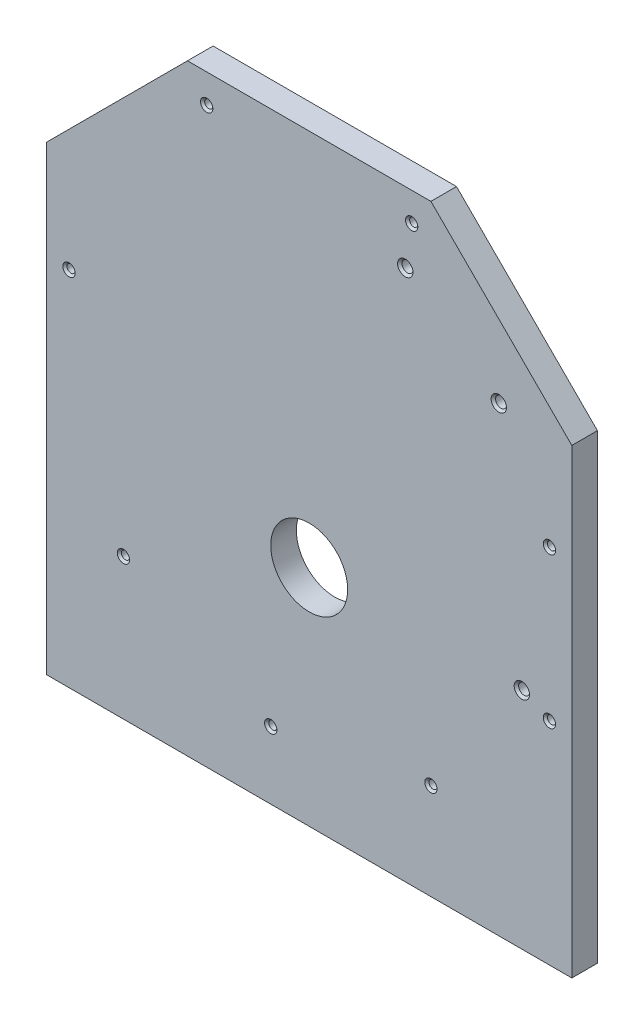
ISO-10303-21;
HEADER;
FILE_DESCRIPTION(('STEP AP214'),'2;1');
FILE_NAME('part.step','',(''),(''),'','','');
FILE_SCHEMA(('AUTOMOTIVE_DESIGN { 1 0 10303 214 1 1 1 1 }'));
ENDSEC;
DATA;
#1=APPLICATION_CONTEXT('core data for automotive mechanical design processes');
#2=APPLICATION_PROTOCOL_DEFINITION('international standard','automotive_design',2000,#1);
#3=PRODUCT_CONTEXT('',#1,'mechanical');
#4=PRODUCT('Part','Part','',(#3));
#5=PRODUCT_RELATED_PRODUCT_CATEGORY('part','',(#4));
#6=PRODUCT_DEFINITION_FORMATION('','',#4);
#7=PRODUCT_DEFINITION_CONTEXT('part definition',#1,'design');
#8=PRODUCT_DEFINITION('design','',#6,#7);
#9=PRODUCT_DEFINITION_SHAPE('','',#8);
#10=(LENGTH_UNIT() NAMED_UNIT(*) SI_UNIT(.MILLI.,.METRE.));
#11=(NAMED_UNIT(*) PLANE_ANGLE_UNIT() SI_UNIT($,.RADIAN.));
#12=(NAMED_UNIT(*) SI_UNIT($,.STERADIAN.) SOLID_ANGLE_UNIT());
#13=UNCERTAINTY_MEASURE_WITH_UNIT(LENGTH_MEASURE(1.E-05),#10,'distance_accuracy_value','');
#14=(GEOMETRIC_REPRESENTATION_CONTEXT(3) GLOBAL_UNCERTAINTY_ASSIGNED_CONTEXT((#13)) GLOBAL_UNIT_ASSIGNED_CONTEXT((#10,
#11,#12)) REPRESENTATION_CONTEXT('',''));
#15=CARTESIAN_POINT('',(0.,0.,0.));
#16=DIRECTION('',(0.,0.,1.));
#17=DIRECTION('',(1.,0.,0.));
#18=AXIS2_PLACEMENT_3D('',#15,#16,#17);
#19=CARTESIAN_POINT('',(0.,0.,0.));
#20=DIRECTION('',(0.,0.,1.));
#21=DIRECTION('',(1.,0.,0.));
#22=AXIS2_PLACEMENT_3D('',#19,#20,#21);
#23=PLANE('',#22);
#24=CARTESIAN_POINT('',(105.41,-57.15,0.));
#25=DIRECTION('',(0.,0.,-1.));
#26=DIRECTION('',(-1.,0.,0.));
#27=AXIS2_PLACEMENT_3D('',#24,#25,#26);
#28=CIRCLE('',#27,3.80999999999999);
#29=CARTESIAN_POINT('',(101.6,-57.15,0.));
#30=VERTEX_POINT('',#29);
#31=EDGE_CURVE('E321',#30,#30,#28,.T.);
#32=ORIENTED_EDGE('',*,*,#31,.F.);
#33=EDGE_LOOP('',(#32));
#34=FACE_BOUND('',#33,.T.);
#35=CARTESIAN_POINT('',(93.98,60.325,0.));
#36=DIRECTION('',(0.,0.,-1.));
#37=DIRECTION('',(-1.,0.,0.));
#38=AXIS2_PLACEMENT_3D('',#35,#36,#37);
#39=CIRCLE('',#38,3.80999999999999);
#40=CARTESIAN_POINT('',(90.17,60.325,0.));
#41=VERTEX_POINT('',#40);
#42=EDGE_CURVE('E337',#41,#41,#39,.T.);
#43=ORIENTED_EDGE('',*,*,#42,.F.);
#44=EDGE_LOOP('',(#43));
#45=FACE_BOUND('',#44,.T.);
#46=CARTESIAN_POINT('',(47.625,95.25,0.));
#47=DIRECTION('',(0.,0.,-1.));
#48=DIRECTION('',(-1.,0.,0.));
#49=AXIS2_PLACEMENT_3D('',#46,#47,#48);
#50=CIRCLE('',#49,3.81);
#51=CARTESIAN_POINT('',(43.815,95.25,0.));
#52=VERTEX_POINT('',#51);
#53=EDGE_CURVE('E348',#52,#52,#50,.T.);
#54=ORIENTED_EDGE('',*,*,#53,.F.);
#55=EDGE_LOOP('',(#54));
#56=FACE_BOUND('',#55,.T.);
#57=CARTESIAN_POINT('',(-50.8,115.8875,0.));
#58=DIRECTION('',(0.,0.,-1.));
#59=DIRECTION('',(-1.,0.,0.));
#60=AXIS2_PLACEMENT_3D('',#57,#58,#59);
#61=CIRCLE('',#60,3.048);
#62=CARTESIAN_POINT('',(-53.848,115.8875,0.));
#63=VERTEX_POINT('',#62);
#64=EDGE_CURVE('E515',#63,#63,#61,.T.);
#65=ORIENTED_EDGE('',*,*,#64,.F.);
#66=EDGE_LOOP('',(#65));
#67=FACE_BOUND('',#66,.T.);
#68=CARTESIAN_POINT('',(-92.075,-98.425,0.));
#69=DIRECTION('',(0.,0.,-1.));
#70=DIRECTION('',(-1.,0.,0.));
#71=AXIS2_PLACEMENT_3D('',#68,#69,#70);
#72=CIRCLE('',#71,3.048);
#73=CARTESIAN_POINT('',(-95.123,-98.425,0.));
#74=VERTEX_POINT('',#73);
#75=EDGE_CURVE('E447',#74,#74,#72,.T.);
#76=ORIENTED_EDGE('',*,*,#75,.F.);
#77=EDGE_LOOP('',(#76));
#78=FACE_BOUND('',#77,.T.);
#79=CARTESIAN_POINT('',(60.325,-120.65,0.));
#80=DIRECTION('',(0.,0.,-1.));
#81=DIRECTION('',(-1.,0.,0.));
#82=AXIS2_PLACEMENT_3D('',#79,#80,#81);
#83=CIRCLE('',#82,3.048);
#84=CARTESIAN_POINT('',(57.277,-120.65,0.));
#85=VERTEX_POINT('',#84);
#86=EDGE_CURVE('E378',#85,#85,#83,.T.);
#87=ORIENTED_EDGE('',*,*,#86,.F.);
#88=EDGE_LOOP('',(#87));
#89=FACE_BOUND('',#88,.T.);
#90=CARTESIAN_POINT('',(119.0752,-63.5,0.));
#91=DIRECTION('',(0.,0.,-1.));
#92=DIRECTION('',(-1.,0.,0.));
#93=AXIS2_PLACEMENT_3D('',#90,#91,#92);
#94=CIRCLE('',#93,3.048);
#95=CARTESIAN_POINT('',(116.0272,-63.5,0.));
#96=VERTEX_POINT('',#95);
#97=EDGE_CURVE('E407',#96,#96,#94,.T.);
#98=ORIENTED_EDGE('',*,*,#97,.F.);
#99=EDGE_LOOP('',(#98));
#100=FACE_BOUND('',#99,.T.);
#101=DIRECTION('',(0.,1.,0.));
#102=VECTOR('',#101,1.);
#103=CARTESIAN_POINT('',(130.175,-168.275,0.));
#104=LINE('',#103,#102);
#105=CARTESIAN_POINT('',(130.175,-168.275,0.));
#106=VERTEX_POINT('',#105);
#107=CARTESIAN_POINT('',(130.175,60.3249999999998,0.));
#108=VERTEX_POINT('',#107);
#109=EDGE_CURVE('E137',#106,#108,#104,.T.);
#110=ORIENTED_EDGE('',*,*,#109,.F.);
#111=DIRECTION('',(1.,0.,0.));
#112=VECTOR('',#111,1.);
#113=CARTESIAN_POINT('',(-130.175,-168.275,0.));
#114=LINE('',#113,#112);
#115=CARTESIAN_POINT('',(-130.175,-168.275,0.));
#116=VERTEX_POINT('',#115);
#117=EDGE_CURVE('E97',#116,#106,#114,.T.);
#118=ORIENTED_EDGE('',*,*,#117,.F.);
#119=DIRECTION('',(0.,-1.,0.));
#120=VECTOR('',#119,1.);
#121=CARTESIAN_POINT('',(-130.175,60.3250000000002,0.));
#122=LINE('',#121,#120);
#123=CARTESIAN_POINT('',(-130.175,60.3250000000002,0.));
#124=VERTEX_POINT('',#123);
#125=EDGE_CURVE('E91',#124,#116,#122,.T.);
#126=ORIENTED_EDGE('',*,*,#125,.F.);
#127=DIRECTION('',(-0.707106781186549,-0.707106781186547,0.));
#128=VECTOR('',#127,1.);
#129=CARTESIAN_POINT('',(-60.325,130.175,0.));
#130=LINE('',#129,#128);
#131=CARTESIAN_POINT('',(-60.325,130.175,0.));
#132=VERTEX_POINT('',#131);
#133=EDGE_CURVE('E127',#132,#124,#130,.T.);
#134=ORIENTED_EDGE('',*,*,#133,.F.);
#135=DIRECTION('',(-1.,0.,0.));
#136=VECTOR('',#135,1.);
#137=CARTESIAN_POINT('',(60.325,130.175,0.));
#138=LINE('',#137,#136);
#139=CARTESIAN_POINT('',(60.325,130.175,0.));
#140=VERTEX_POINT('',#139);
#141=EDGE_CURVE('E143',#140,#132,#138,.T.);
#142=ORIENTED_EDGE('',*,*,#141,.F.);
#143=DIRECTION('',(-0.707106781186546,0.707106781186549,0.));
#144=VECTOR('',#143,1.);
#145=CARTESIAN_POINT('',(130.175,60.3249999999998,0.));
#146=LINE('',#145,#144);
#147=EDGE_CURVE('E140',#108,#140,#146,.T.);
#148=ORIENTED_EDGE('',*,*,#147,.F.);
#149=EDGE_LOOP('',(#110,#118,#126,#134,#142,#148));
#150=FACE_BOUND('',#149,.T.);
#151=CARTESIAN_POINT('',(0.,-57.15,0.));
#152=DIRECTION('',(0.,0.,1.));
#153=DIRECTION('',(1.,0.,0.));
#154=AXIS2_PLACEMENT_3D('',#151,#152,#153);
#155=CIRCLE('',#154,19.0754);
#156=CARTESIAN_POINT('',(19.0754,-57.15,0.));
#157=VERTEX_POINT('',#156);
#158=EDGE_CURVE('E418',#157,#157,#155,.T.);
#159=ORIENTED_EDGE('',*,*,#158,.T.);
#160=EDGE_LOOP('',(#159));
#161=FACE_BOUND('',#160,.T.);
#162=CARTESIAN_POINT('',(119.0752,11.1252,0.));
#163=DIRECTION('',(0.,0.,-1.));
#164=DIRECTION('',(-1.,0.,0.));
#165=AXIS2_PLACEMENT_3D('',#162,#163,#164);
#166=CIRCLE('',#165,3.048);
#167=CARTESIAN_POINT('',(116.0272,11.1252,0.));
#168=VERTEX_POINT('',#167);
#169=EDGE_CURVE('E394',#168,#168,#166,.T.);
#170=ORIENTED_EDGE('',*,*,#169,.F.);
#171=EDGE_LOOP('',(#170));
#172=FACE_BOUND('',#171,.T.);
#173=CARTESIAN_POINT('',(-19.05,-134.9375,0.));
#174=DIRECTION('',(0.,0.,-1.));
#175=DIRECTION('',(-1.,0.,0.));
#176=AXIS2_PLACEMENT_3D('',#173,#174,#175);
#177=CIRCLE('',#176,3.048);
#178=CARTESIAN_POINT('',(-22.098,-134.9375,0.));
#179=VERTEX_POINT('',#178);
#180=EDGE_CURVE('E460',#179,#179,#177,.T.);
#181=ORIENTED_EDGE('',*,*,#180,.F.);
#182=EDGE_LOOP('',(#181));
#183=FACE_BOUND('',#182,.T.);
#184=CARTESIAN_POINT('',(-119.0752,11.1252,0.));
#185=DIRECTION('',(0.,0.,-1.));
#186=DIRECTION('',(-1.,0.,0.));
#187=AXIS2_PLACEMENT_3D('',#184,#185,#186);
#188=CIRCLE('',#187,3.048);
#189=CARTESIAN_POINT('',(-122.1232,11.1252,0.));
#190=VERTEX_POINT('',#189);
#191=EDGE_CURVE('E431',#190,#190,#188,.T.);
#192=ORIENTED_EDGE('',*,*,#191,.F.);
#193=EDGE_LOOP('',(#192));
#194=FACE_BOUND('',#193,.T.);
#195=CARTESIAN_POINT('',(50.8,115.8875,0.));
#196=DIRECTION('',(0.,0.,-1.));
#197=DIRECTION('',(-1.,0.,0.));
#198=AXIS2_PLACEMENT_3D('',#195,#196,#197);
#199=CIRCLE('',#198,3.048);
#200=CARTESIAN_POINT('',(47.752,115.8875,0.));
#201=VERTEX_POINT('',#200);
#202=EDGE_CURVE('E364',#201,#201,#199,.T.);
#203=ORIENTED_EDGE('',*,*,#202,.F.);
#204=EDGE_LOOP('',(#203));
#205=FACE_BOUND('',#204,.T.);
#206=ADVANCED_FACE('F48',(#34,#45,#56,#67,#78,#89,#100,#150,#161,#172,#183,#194,#205),#23,.F.);
#207=CARTESIAN_POINT('',(0.,0.,12.7));
#208=DIRECTION('',(0.,0.,1.));
#209=DIRECTION('',(1.,0.,0.));
#210=AXIS2_PLACEMENT_3D('',#207,#208,#209);
#211=PLANE('',#210);
#212=CARTESIAN_POINT('',(105.41,-57.15,12.7));
#213=DIRECTION('',(0.,0.,-1.));
#214=DIRECTION('',(-1.,0.,0.));
#215=AXIS2_PLACEMENT_3D('',#212,#213,#214);
#216=CIRCLE('',#215,3.80999999999999);
#217=CARTESIAN_POINT('',(101.6,-57.15,12.7));
#218=VERTEX_POINT('',#217);
#219=EDGE_CURVE('E323',#218,#218,#216,.T.);
#220=ORIENTED_EDGE('',*,*,#219,.T.);
#221=EDGE_LOOP('',(#220));
#222=FACE_BOUND('',#221,.T.);
#223=CARTESIAN_POINT('',(93.98,60.325,12.7));
#224=DIRECTION('',(0.,0.,-1.));
#225=DIRECTION('',(-1.,0.,0.));
#226=AXIS2_PLACEMENT_3D('',#223,#224,#225);
#227=CIRCLE('',#226,3.80999999999999);
#228=CARTESIAN_POINT('',(90.17,60.325,12.7));
#229=VERTEX_POINT('',#228);
#230=EDGE_CURVE('E334',#229,#229,#227,.T.);
#231=ORIENTED_EDGE('',*,*,#230,.T.);
#232=EDGE_LOOP('',(#231));
#233=FACE_BOUND('',#232,.T.);
#234=CARTESIAN_POINT('',(47.625,95.25,12.7));
#235=DIRECTION('',(0.,0.,-1.));
#236=DIRECTION('',(-1.,0.,0.));
#237=AXIS2_PLACEMENT_3D('',#234,#235,#236);
#238=CIRCLE('',#237,3.80999999999999);
#239=CARTESIAN_POINT('',(43.815,95.25,12.7));
#240=VERTEX_POINT('',#239);
#241=EDGE_CURVE('E355',#240,#240,#238,.T.);
#242=ORIENTED_EDGE('',*,*,#241,.T.);
#243=EDGE_LOOP('',(#242));
#244=FACE_BOUND('',#243,.T.);
#245=CARTESIAN_POINT('',(50.8,115.8875,12.7));
#246=DIRECTION('',(0.,0.,-1.));
#247=DIRECTION('',(-1.,0.,0.));
#248=AXIS2_PLACEMENT_3D('',#245,#246,#247);
#249=CIRCLE('',#248,3.048);
#250=CARTESIAN_POINT('',(47.752,115.8875,12.7));
#251=VERTEX_POINT('',#250);
#252=EDGE_CURVE('E361',#251,#251,#249,.T.);
#253=ORIENTED_EDGE('',*,*,#252,.T.);
#254=EDGE_LOOP('',(#253));
#255=FACE_BOUND('',#254,.T.);
#256=CARTESIAN_POINT('',(-50.8,115.8875,12.7));
#257=DIRECTION('',(0.,0.,-1.));
#258=DIRECTION('',(-1.,0.,0.));
#259=AXIS2_PLACEMENT_3D('',#256,#257,#258);
#260=CIRCLE('',#259,3.048);
#261=CARTESIAN_POINT('',(-53.848,115.8875,12.7));
#262=VERTEX_POINT('',#261);
#263=EDGE_CURVE('E533',#262,#262,#260,.T.);
#264=ORIENTED_EDGE('',*,*,#263,.T.);
#265=EDGE_LOOP('',(#264));
#266=FACE_BOUND('',#265,.T.);
#267=CARTESIAN_POINT('',(-119.0752,11.1252,12.7));
#268=DIRECTION('',(0.,0.,-1.));
#269=DIRECTION('',(-1.,0.,0.));
#270=AXIS2_PLACEMENT_3D('',#267,#268,#269);
#271=CIRCLE('',#270,3.048);
#272=CARTESIAN_POINT('',(-122.1232,11.1252,12.7));
#273=VERTEX_POINT('',#272);
#274=EDGE_CURVE('E438',#273,#273,#271,.T.);
#275=ORIENTED_EDGE('',*,*,#274,.T.);
#276=EDGE_LOOP('',(#275));
#277=FACE_BOUND('',#276,.T.);
#278=CARTESIAN_POINT('',(-92.075,-98.425,12.7));
#279=DIRECTION('',(0.,0.,-1.));
#280=DIRECTION('',(-1.,0.,0.));
#281=AXIS2_PLACEMENT_3D('',#278,#279,#280);
#282=CIRCLE('',#281,3.048);
#283=CARTESIAN_POINT('',(-95.123,-98.425,12.7));
#284=VERTEX_POINT('',#283);
#285=EDGE_CURVE('E445',#284,#284,#282,.T.);
#286=ORIENTED_EDGE('',*,*,#285,.T.);
#287=EDGE_LOOP('',(#286));
#288=FACE_BOUND('',#287,.T.);
#289=CARTESIAN_POINT('',(-19.05,-134.9375,12.7));
#290=DIRECTION('',(0.,0.,-1.));
#291=DIRECTION('',(-1.,0.,0.));
#292=AXIS2_PLACEMENT_3D('',#289,#290,#291);
#293=CIRCLE('',#292,3.048);
#294=CARTESIAN_POINT('',(-22.098,-134.9375,12.7));
#295=VERTEX_POINT('',#294);
#296=EDGE_CURVE('E458',#295,#295,#293,.T.);
#297=ORIENTED_EDGE('',*,*,#296,.T.);
#298=EDGE_LOOP('',(#297));
#299=FACE_BOUND('',#298,.T.);
#300=CARTESIAN_POINT('',(60.325,-120.65,12.7));
#301=DIRECTION('',(0.,0.,-1.));
#302=DIRECTION('',(-1.,0.,0.));
#303=AXIS2_PLACEMENT_3D('',#300,#301,#302);
#304=CIRCLE('',#303,3.048);
#305=CARTESIAN_POINT('',(57.277,-120.65,12.7));
#306=VERTEX_POINT('',#305);
#307=EDGE_CURVE('E385',#306,#306,#304,.T.);
#308=ORIENTED_EDGE('',*,*,#307,.T.);
#309=EDGE_LOOP('',(#308));
#310=FACE_BOUND('',#309,.T.);
#311=CARTESIAN_POINT('',(119.0752,11.1252,12.7));
#312=DIRECTION('',(0.,0.,-1.));
#313=DIRECTION('',(-1.,0.,0.));
#314=AXIS2_PLACEMENT_3D('',#311,#312,#313);
#315=CIRCLE('',#314,3.048);
#316=CARTESIAN_POINT('',(116.0272,11.1252,12.7));
#317=VERTEX_POINT('',#316);
#318=EDGE_CURVE('E392',#317,#317,#315,.T.);
#319=ORIENTED_EDGE('',*,*,#318,.T.);
#320=EDGE_LOOP('',(#319));
#321=FACE_BOUND('',#320,.T.);
#322=CARTESIAN_POINT('',(119.0752,-63.5,12.7));
#323=DIRECTION('',(0.,0.,-1.));
#324=DIRECTION('',(-1.,0.,0.));
#325=AXIS2_PLACEMENT_3D('',#322,#323,#324);
#326=CIRCLE('',#325,3.048);
#327=CARTESIAN_POINT('',(116.0272,-63.5,12.7));
#328=VERTEX_POINT('',#327);
#329=EDGE_CURVE('E405',#328,#328,#326,.T.);
#330=ORIENTED_EDGE('',*,*,#329,.T.);
#331=EDGE_LOOP('',(#330));
#332=FACE_BOUND('',#331,.T.);
#333=DIRECTION('',(0.,1.,0.));
#334=VECTOR('',#333,1.);
#335=CARTESIAN_POINT('',(130.175,-168.275,12.7));
#336=LINE('',#335,#334);
#337=CARTESIAN_POINT('',(130.175,-168.275,12.7));
#338=VERTEX_POINT('',#337);
#339=CARTESIAN_POINT('',(130.175,60.3249999999998,12.7));
#340=VERTEX_POINT('',#339);
#341=EDGE_CURVE('E148',#338,#340,#336,.T.);
#342=ORIENTED_EDGE('',*,*,#341,.T.);
#343=DIRECTION('',(-0.707106781186546,0.707106781186549,0.));
#344=VECTOR('',#343,1.);
#345=CARTESIAN_POINT('',(130.175,60.3249999999998,12.7));
#346=LINE('',#345,#344);
#347=CARTESIAN_POINT('',(60.325,130.175,12.7));
#348=VERTEX_POINT('',#347);
#349=EDGE_CURVE('E105',#340,#348,#346,.T.);
#350=ORIENTED_EDGE('',*,*,#349,.T.);
#351=DIRECTION('',(-1.,0.,0.));
#352=VECTOR('',#351,1.);
#353=CARTESIAN_POINT('',(60.325,130.175,12.7));
#354=LINE('',#353,#352);
#355=CARTESIAN_POINT('',(-60.325,130.175,12.7));
#356=VERTEX_POINT('',#355);
#357=EDGE_CURVE('E119',#348,#356,#354,.T.);
#358=ORIENTED_EDGE('',*,*,#357,.T.);
#359=DIRECTION('',(-0.707106781186549,-0.707106781186547,0.));
#360=VECTOR('',#359,1.);
#361=CARTESIAN_POINT('',(-60.325,130.175,12.7));
#362=LINE('',#361,#360);
#363=CARTESIAN_POINT('',(-130.175,60.3250000000002,12.7));
#364=VERTEX_POINT('',#363);
#365=EDGE_CURVE('E112',#356,#364,#362,.T.);
#366=ORIENTED_EDGE('',*,*,#365,.T.);
#367=DIRECTION('',(0.,-1.,0.));
#368=VECTOR('',#367,1.);
#369=CARTESIAN_POINT('',(-130.175,60.3250000000002,12.7));
#370=LINE('',#369,#368);
#371=CARTESIAN_POINT('',(-130.175,-168.275,12.7));
#372=VERTEX_POINT('',#371);
#373=EDGE_CURVE('E117',#364,#372,#370,.T.);
#374=ORIENTED_EDGE('',*,*,#373,.T.);
#375=DIRECTION('',(1.,0.,0.));
#376=VECTOR('',#375,1.);
#377=CARTESIAN_POINT('',(-130.175,-168.275,12.7));
#378=LINE('',#377,#376);
#379=EDGE_CURVE('E65',#372,#338,#378,.T.);
#380=ORIENTED_EDGE('',*,*,#379,.T.);
#381=EDGE_LOOP('',(#342,#350,#358,#366,#374,#380));
#382=FACE_BOUND('',#381,.T.);
#383=CARTESIAN_POINT('',(0.,-57.15,12.7));
#384=DIRECTION('',(0.,0.,1.));
#385=DIRECTION('',(1.,0.,0.));
#386=AXIS2_PLACEMENT_3D('',#383,#384,#385);
#387=CIRCLE('',#386,19.0754);
#388=CARTESIAN_POINT('',(19.0754,-57.15,12.7));
#389=VERTEX_POINT('',#388);
#390=EDGE_CURVE('E141',#389,#389,#387,.T.);
#391=ORIENTED_EDGE('',*,*,#390,.F.);
#392=EDGE_LOOP('',(#391));
#393=FACE_BOUND('',#392,.T.);
#394=ADVANCED_FACE('F114',(#222,#233,#244,#255,#266,#277,#288,#299,#310,#321,#332,#382,#393),
#211,.T.);
#395=CARTESIAN_POINT('',(130.175,-168.275,12.7));
#396=DIRECTION('',(-1.,0.,0.));
#397=DIRECTION('',(0.,-1.,0.));
#398=AXIS2_PLACEMENT_3D('',#395,#396,#397);
#399=PLANE('',#398);
#400=ORIENTED_EDGE('',*,*,#109,.T.);
#401=DIRECTION('',(0.,0.,-1.));
#402=VECTOR('',#401,1.);
#403=CARTESIAN_POINT('',(130.175,60.3249999999998,12.7));
#404=LINE('',#403,#402);
#405=EDGE_CURVE('E12',#340,#108,#404,.T.);
#406=ORIENTED_EDGE('',*,*,#405,.F.);
#407=ORIENTED_EDGE('',*,*,#341,.F.);
#408=DIRECTION('',(0.,0.,-1.));
#409=VECTOR('',#408,1.);
#410=CARTESIAN_POINT('',(130.175,-168.275,12.7));
#411=LINE('',#410,#409);
#412=EDGE_CURVE('E133',#338,#106,#411,.T.);
#413=ORIENTED_EDGE('',*,*,#412,.T.);
#414=EDGE_LOOP('',(#400,#406,#407,#413));
#415=FACE_BOUND('',#414,.T.);
#416=ADVANCED_FACE('F50',(#415),#399,.F.);
#417=CARTESIAN_POINT('',(130.175,60.3249999999998,12.7));
#418=DIRECTION('',(-0.707106781186548,-0.707106781186546,0.));
#419=DIRECTION('',(0.707106781186547,-0.707106781186549,0.));
#420=AXIS2_PLACEMENT_3D('',#417,#418,#419);
#421=PLANE('',#420);
#422=ORIENTED_EDGE('',*,*,#147,.T.);
#423=DIRECTION('',(0.,0.,-1.));
#424=VECTOR('',#423,1.);
#425=CARTESIAN_POINT('',(60.325,130.175,12.7));
#426=LINE('',#425,#424);
#427=EDGE_CURVE('E57',#348,#140,#426,.T.);
#428=ORIENTED_EDGE('',*,*,#427,.F.);
#429=ORIENTED_EDGE('',*,*,#349,.F.);
#430=ORIENTED_EDGE('',*,*,#405,.T.);
#431=EDGE_LOOP('',(#422,#428,#429,#430));
#432=FACE_BOUND('',#431,.T.);
#433=ADVANCED_FACE('F551',(#432),#421,.F.);
#434=CARTESIAN_POINT('',(60.325,130.175,12.7));
#435=DIRECTION('',(0.,-1.,0.));
#436=DIRECTION('',(0.,0.,-1.));
#437=AXIS2_PLACEMENT_3D('',#434,#435,#436);
#438=PLANE('',#437);
#439=ORIENTED_EDGE('',*,*,#141,.T.);
#440=DIRECTION('',(0.,0.,-1.));
#441=VECTOR('',#440,1.);
#442=CARTESIAN_POINT('',(-60.325,130.175,12.7));
#443=LINE('',#442,#441);
#444=EDGE_CURVE('E128',#356,#132,#443,.T.);
#445=ORIENTED_EDGE('',*,*,#444,.F.);
#446=ORIENTED_EDGE('',*,*,#357,.F.);
#447=ORIENTED_EDGE('',*,*,#427,.T.);
#448=EDGE_LOOP('',(#439,#445,#446,#447));
#449=FACE_BOUND('',#448,.T.);
#450=ADVANCED_FACE('F154',(#449),#438,.F.);
#451=CARTESIAN_POINT('',(-60.325,130.175,12.7));
#452=DIRECTION('',(0.707106781186547,-0.707106781186548,0.));
#453=DIRECTION('',(0.707106781186548,0.707106781186547,0.));
#454=AXIS2_PLACEMENT_3D('',#451,#452,#453);
#455=PLANE('',#454);
#456=ORIENTED_EDGE('',*,*,#133,.T.);
#457=DIRECTION('',(0.,0.,-1.));
#458=VECTOR('',#457,1.);
#459=CARTESIAN_POINT('',(-130.175,60.3250000000002,12.7));
#460=LINE('',#459,#458);
#461=EDGE_CURVE('E124',#364,#124,#460,.T.);
#462=ORIENTED_EDGE('',*,*,#461,.F.);
#463=ORIENTED_EDGE('',*,*,#365,.F.);
#464=ORIENTED_EDGE('',*,*,#444,.T.);
#465=EDGE_LOOP('',(#456,#462,#463,#464));
#466=FACE_BOUND('',#465,.T.);
#467=ADVANCED_FACE('F125',(#466),#455,.F.);
#468=CARTESIAN_POINT('',(-130.175,60.3250000000002,12.7));
#469=DIRECTION('',(1.,0.,0.));
#470=DIRECTION('',(0.,1.,0.));
#471=AXIS2_PLACEMENT_3D('',#468,#469,#470);
#472=PLANE('',#471);
#473=ORIENTED_EDGE('',*,*,#125,.T.);
#474=DIRECTION('',(0.,0.,-1.));
#475=VECTOR('',#474,1.);
#476=CARTESIAN_POINT('',(-130.175,-168.275,12.7));
#477=LINE('',#476,#475);
#478=EDGE_CURVE('E129',#372,#116,#477,.T.);
#479=ORIENTED_EDGE('',*,*,#478,.F.);
#480=ORIENTED_EDGE('',*,*,#373,.F.);
#481=ORIENTED_EDGE('',*,*,#461,.T.);
#482=EDGE_LOOP('',(#473,#479,#480,#481));
#483=FACE_BOUND('',#482,.T.);
#484=ADVANCED_FACE('F131',(#483),#472,.F.);
#485=CARTESIAN_POINT('',(-130.175,-168.275,12.7));
#486=DIRECTION('',(0.,1.,0.));
#487=DIRECTION('',(0.,0.,1.));
#488=AXIS2_PLACEMENT_3D('',#485,#486,#487);
#489=PLANE('',#488);
#490=ORIENTED_EDGE('',*,*,#117,.T.);
#491=ORIENTED_EDGE('',*,*,#412,.F.);
#492=ORIENTED_EDGE('',*,*,#379,.F.);
#493=ORIENTED_EDGE('',*,*,#478,.T.);
#494=EDGE_LOOP('',(#490,#491,#492,#493));
#495=FACE_BOUND('',#494,.T.);
#496=ADVANCED_FACE('F161',(#495),#489,.F.);
#497=CARTESIAN_POINT('',(0.,-57.15,12.7));
#498=DIRECTION('',(0.,0.,-1.));
#499=DIRECTION('',(-1.,0.,0.));
#500=AXIS2_PLACEMENT_3D('',#497,#498,#499);
#501=CYLINDRICAL_SURFACE('',#500,19.0754);
#502=ORIENTED_EDGE('',*,*,#390,.T.);
#503=EDGE_LOOP('',(#502));
#504=FACE_BOUND('',#503,.T.);
#505=ORIENTED_EDGE('',*,*,#158,.F.);
#506=EDGE_LOOP('',(#505));
#507=FACE_BOUND('',#506,.T.);
#508=ADVANCED_FACE('F163',(#504,#507),#501,.F.);
#509=CARTESIAN_POINT('',(119.0752,-63.5,11.6713));
#510=DIRECTION('',(0.,0.,1.));
#511=DIRECTION('',(1.,0.,0.));
#512=AXIS2_PLACEMENT_3D('',#509,#510,#511);
#513=CONICAL_SURFACE('',#512,2.0193,0.785398163397443);
#514=ORIENTED_EDGE('',*,*,#329,.F.);
#515=EDGE_LOOP('',(#514));
#516=FACE_BOUND('',#515,.T.);
#517=CARTESIAN_POINT('',(119.0752,-63.5,11.6713));
#518=DIRECTION('',(0.,0.,-1.));
#519=DIRECTION('',(-1.,0.,0.));
#520=AXIS2_PLACEMENT_3D('',#517,#518,#519);
#521=CIRCLE('',#520,2.0193);
#522=CARTESIAN_POINT('',(117.0559,-63.5,11.6713));
#523=VERTEX_POINT('',#522);
#524=EDGE_CURVE('E415',#523,#523,#521,.T.);
#525=ORIENTED_EDGE('',*,*,#524,.T.);
#526=EDGE_LOOP('',(#525));
#527=FACE_BOUND('',#526,.T.);
#528=ADVANCED_FACE('F169',(#516,#527),#513,.F.);
#529=CARTESIAN_POINT('',(119.0752,-63.5,0.));
#530=DIRECTION('',(0.,0.,-1.));
#531=DIRECTION('',(-1.,0.,0.));
#532=AXIS2_PLACEMENT_3D('',#529,#530,#531);
#533=CYLINDRICAL_SURFACE('',#532,2.0193);
#534=ORIENTED_EDGE('',*,*,#524,.F.);
#535=EDGE_LOOP('',(#534));
#536=FACE_BOUND('',#535,.T.);
#537=CARTESIAN_POINT('',(119.0752,-63.5,1.0287));
#538=DIRECTION('',(0.,0.,-1.));
#539=DIRECTION('',(-1.,0.,0.));
#540=AXIS2_PLACEMENT_3D('',#537,#538,#539);
#541=CIRCLE('',#540,2.0193);
#542=CARTESIAN_POINT('',(117.0559,-63.5,1.0287));
#543=VERTEX_POINT('',#542);
#544=EDGE_CURVE('E412',#543,#543,#541,.T.);
#545=ORIENTED_EDGE('',*,*,#544,.T.);
#546=EDGE_LOOP('',(#545));
#547=FACE_BOUND('',#546,.T.);
#548=ADVANCED_FACE('F186',(#536,#547),#533,.F.);
#549=CARTESIAN_POINT('',(119.0752,-63.5,0.));
#550=DIRECTION('',(0.,0.,-1.));
#551=DIRECTION('',(-1.,0.,0.));
#552=AXIS2_PLACEMENT_3D('',#549,#550,#551);
#553=CONICAL_SURFACE('',#552,3.048,0.785398163397446);
#554=ORIENTED_EDGE('',*,*,#544,.F.);
#555=EDGE_LOOP('',(#554));
#556=FACE_BOUND('',#555,.T.);
#557=ORIENTED_EDGE('',*,*,#97,.T.);
#558=EDGE_LOOP('',(#557));
#559=FACE_BOUND('',#558,.T.);
#560=ADVANCED_FACE('F190',(#556,#559),#553,.F.);
#561=CARTESIAN_POINT('',(119.0752,11.1252,11.6713));
#562=DIRECTION('',(0.,0.,1.));
#563=DIRECTION('',(1.,0.,0.));
#564=AXIS2_PLACEMENT_3D('',#561,#562,#563);
#565=CONICAL_SURFACE('',#564,2.0193,0.785398163397443);
#566=ORIENTED_EDGE('',*,*,#318,.F.);
#567=EDGE_LOOP('',(#566));
#568=FACE_BOUND('',#567,.T.);
#569=CARTESIAN_POINT('',(119.0752,11.1252,11.6713));
#570=DIRECTION('',(0.,0.,-1.));
#571=DIRECTION('',(-1.,0.,0.));
#572=AXIS2_PLACEMENT_3D('',#569,#570,#571);
#573=CIRCLE('',#572,2.0193);
#574=CARTESIAN_POINT('',(117.0559,11.1252,11.6713));
#575=VERTEX_POINT('',#574);
#576=EDGE_CURVE('E402',#575,#575,#573,.T.);
#577=ORIENTED_EDGE('',*,*,#576,.T.);
#578=EDGE_LOOP('',(#577));
#579=FACE_BOUND('',#578,.T.);
#580=ADVANCED_FACE('F194',(#568,#579),#565,.F.);
#581=CARTESIAN_POINT('',(119.0752,11.1252,0.));
#582=DIRECTION('',(0.,0.,-1.));
#583=DIRECTION('',(-1.,0.,0.));
#584=AXIS2_PLACEMENT_3D('',#581,#582,#583);
#585=CYLINDRICAL_SURFACE('',#584,2.0193);
#586=ORIENTED_EDGE('',*,*,#576,.F.);
#587=EDGE_LOOP('',(#586));
#588=FACE_BOUND('',#587,.T.);
#589=CARTESIAN_POINT('',(119.0752,11.1252,1.0287));
#590=DIRECTION('',(0.,0.,-1.));
#591=DIRECTION('',(-1.,0.,0.));
#592=AXIS2_PLACEMENT_3D('',#589,#590,#591);
#593=CIRCLE('',#592,2.0193);
#594=CARTESIAN_POINT('',(117.0559,11.1252,1.0287));
#595=VERTEX_POINT('',#594);
#596=EDGE_CURVE('E399',#595,#595,#593,.T.);
#597=ORIENTED_EDGE('',*,*,#596,.T.);
#598=EDGE_LOOP('',(#597));
#599=FACE_BOUND('',#598,.T.);
#600=ADVANCED_FACE('F198',(#588,#599),#585,.F.);
#601=CARTESIAN_POINT('',(119.0752,11.1252,0.));
#602=DIRECTION('',(0.,0.,-1.));
#603=DIRECTION('',(-1.,0.,0.));
#604=AXIS2_PLACEMENT_3D('',#601,#602,#603);
#605=CONICAL_SURFACE('',#604,3.048,0.785398163397446);
#606=ORIENTED_EDGE('',*,*,#596,.F.);
#607=EDGE_LOOP('',(#606));
#608=FACE_BOUND('',#607,.T.);
#609=ORIENTED_EDGE('',*,*,#169,.T.);
#610=EDGE_LOOP('',(#609));
#611=FACE_BOUND('',#610,.T.);
#612=ADVANCED_FACE('F202',(#608,#611),#605,.F.);
#613=CARTESIAN_POINT('',(60.325,-120.65,11.6713));
#614=DIRECTION('',(0.,0.,1.));
#615=DIRECTION('',(1.,0.,0.));
#616=AXIS2_PLACEMENT_3D('',#613,#614,#615);
#617=CONICAL_SURFACE('',#616,2.01929999999999,0.78539816339745);
#618=ORIENTED_EDGE('',*,*,#307,.F.);
#619=EDGE_LOOP('',(#618));
#620=FACE_BOUND('',#619,.T.);
#621=CARTESIAN_POINT('',(60.325,-120.65,11.6713));
#622=DIRECTION('',(0.,0.,-1.));
#623=DIRECTION('',(-1.,0.,0.));
#624=AXIS2_PLACEMENT_3D('',#621,#622,#623);
#625=CIRCLE('',#624,2.01929999999999);
#626=CARTESIAN_POINT('',(58.3057,-120.65,11.6713));
#627=VERTEX_POINT('',#626);
#628=EDGE_CURVE('E389',#627,#627,#625,.T.);
#629=ORIENTED_EDGE('',*,*,#628,.T.);
#630=EDGE_LOOP('',(#629));
#631=FACE_BOUND('',#630,.T.);
#632=ADVANCED_FACE('F206',(#620,#631),#617,.F.);
#633=CARTESIAN_POINT('',(60.325,-120.65,0.));
#634=DIRECTION('',(0.,0.,-1.));
#635=DIRECTION('',(-1.,0.,0.));
#636=AXIS2_PLACEMENT_3D('',#633,#634,#635);
#637=CYLINDRICAL_SURFACE('',#636,2.0193);
#638=ORIENTED_EDGE('',*,*,#628,.F.);
#639=EDGE_LOOP('',(#638));
#640=FACE_BOUND('',#639,.T.);
#641=CARTESIAN_POINT('',(60.325,-120.65,1.0287));
#642=DIRECTION('',(0.,0.,-1.));
#643=DIRECTION('',(-1.,0.,0.));
#644=AXIS2_PLACEMENT_3D('',#641,#642,#643);
#645=CIRCLE('',#644,2.0193);
#646=CARTESIAN_POINT('',(58.3057,-120.65,1.0287));
#647=VERTEX_POINT('',#646);
#648=EDGE_CURVE('E384',#647,#647,#645,.T.);
#649=ORIENTED_EDGE('',*,*,#648,.T.);
#650=EDGE_LOOP('',(#649));
#651=FACE_BOUND('',#650,.T.);
#652=ADVANCED_FACE('F210',(#640,#651),#637,.F.);
#653=CARTESIAN_POINT('',(60.325,-120.65,0.));
#654=DIRECTION('',(0.,0.,-1.));
#655=DIRECTION('',(-1.,0.,0.));
#656=AXIS2_PLACEMENT_3D('',#653,#654,#655);
#657=CONICAL_SURFACE('',#656,3.048,0.785398163397449);
#658=ORIENTED_EDGE('',*,*,#648,.F.);
#659=EDGE_LOOP('',(#658));
#660=FACE_BOUND('',#659,.T.);
#661=ORIENTED_EDGE('',*,*,#86,.T.);
#662=EDGE_LOOP('',(#661));
#663=FACE_BOUND('',#662,.T.);
#664=ADVANCED_FACE('F214',(#660,#663),#657,.F.);
#665=CARTESIAN_POINT('',(-19.05,-134.9375,11.6713));
#666=DIRECTION('',(0.,0.,1.));
#667=DIRECTION('',(1.,0.,0.));
#668=AXIS2_PLACEMENT_3D('',#665,#666,#667);
#669=CONICAL_SURFACE('',#668,2.0193,0.785398163397445);
#670=ORIENTED_EDGE('',*,*,#296,.F.);
#671=EDGE_LOOP('',(#670));
#672=FACE_BOUND('',#671,.T.);
#673=CARTESIAN_POINT('',(-19.05,-134.9375,11.6713));
#674=DIRECTION('',(0.,0.,-1.));
#675=DIRECTION('',(-1.,0.,0.));
#676=AXIS2_PLACEMENT_3D('',#673,#674,#675);
#677=CIRCLE('',#676,2.0193);
#678=CARTESIAN_POINT('',(-21.0693,-134.9375,11.6713));
#679=VERTEX_POINT('',#678);
#680=EDGE_CURVE('E467',#679,#679,#677,.T.);
#681=ORIENTED_EDGE('',*,*,#680,.T.);
#682=EDGE_LOOP('',(#681));
#683=FACE_BOUND('',#682,.T.);
#684=ADVANCED_FACE('F218',(#672,#683),#669,.F.);
#685=CARTESIAN_POINT('',(-19.05,-134.9375,0.));
#686=DIRECTION('',(0.,0.,-1.));
#687=DIRECTION('',(-1.,0.,0.));
#688=AXIS2_PLACEMENT_3D('',#685,#686,#687);
#689=CYLINDRICAL_SURFACE('',#688,2.0193);
#690=ORIENTED_EDGE('',*,*,#680,.F.);
#691=EDGE_LOOP('',(#690));
#692=FACE_BOUND('',#691,.T.);
#693=CARTESIAN_POINT('',(-19.05,-134.9375,1.0287));
#694=DIRECTION('',(0.,0.,-1.));
#695=DIRECTION('',(-1.,0.,0.));
#696=AXIS2_PLACEMENT_3D('',#693,#694,#695);
#697=CIRCLE('',#696,2.0193);
#698=CARTESIAN_POINT('',(-21.0693,-134.9375,1.0287));
#699=VERTEX_POINT('',#698);
#700=EDGE_CURVE('E465',#699,#699,#697,.T.);
#701=ORIENTED_EDGE('',*,*,#700,.T.);
#702=EDGE_LOOP('',(#701));
#703=FACE_BOUND('',#702,.T.);
#704=ADVANCED_FACE('F222',(#692,#703),#689,.F.);
#705=CARTESIAN_POINT('',(-19.05,-134.9375,0.));
#706=DIRECTION('',(0.,0.,-1.));
#707=DIRECTION('',(-1.,0.,0.));
#708=AXIS2_PLACEMENT_3D('',#705,#706,#707);
#709=CONICAL_SURFACE('',#708,3.048,0.785398163397449);
#710=ORIENTED_EDGE('',*,*,#700,.F.);
#711=EDGE_LOOP('',(#710));
#712=FACE_BOUND('',#711,.T.);
#713=ORIENTED_EDGE('',*,*,#180,.T.);
#714=EDGE_LOOP('',(#713));
#715=FACE_BOUND('',#714,.T.);
#716=ADVANCED_FACE('F226',(#712,#715),#709,.F.);
#717=CARTESIAN_POINT('',(-92.075,-98.425,11.6713));
#718=DIRECTION('',(0.,0.,1.));
#719=DIRECTION('',(1.,0.,0.));
#720=AXIS2_PLACEMENT_3D('',#717,#718,#719);
#721=CONICAL_SURFACE('',#720,2.0193,0.785398163397443);
#722=ORIENTED_EDGE('',*,*,#285,.F.);
#723=EDGE_LOOP('',(#722));
#724=FACE_BOUND('',#723,.T.);
#725=CARTESIAN_POINT('',(-92.075,-98.425,11.6713));
#726=DIRECTION('',(0.,0.,-1.));
#727=DIRECTION('',(-1.,0.,0.));
#728=AXIS2_PLACEMENT_3D('',#725,#726,#727);
#729=CIRCLE('',#728,2.0193);
#730=CARTESIAN_POINT('',(-94.0943,-98.425,11.6713));
#731=VERTEX_POINT('',#730);
#732=EDGE_CURVE('E455',#731,#731,#729,.T.);
#733=ORIENTED_EDGE('',*,*,#732,.T.);
#734=EDGE_LOOP('',(#733));
#735=FACE_BOUND('',#734,.T.);
#736=ADVANCED_FACE('F230',(#724,#735),#721,.F.);
#737=CARTESIAN_POINT('',(-92.075,-98.425,0.));
#738=DIRECTION('',(0.,0.,-1.));
#739=DIRECTION('',(-1.,0.,0.));
#740=AXIS2_PLACEMENT_3D('',#737,#738,#739);
#741=CYLINDRICAL_SURFACE('',#740,2.0193);
#742=ORIENTED_EDGE('',*,*,#732,.F.);
#743=EDGE_LOOP('',(#742));
#744=FACE_BOUND('',#743,.T.);
#745=CARTESIAN_POINT('',(-92.075,-98.425,1.0287));
#746=DIRECTION('',(0.,0.,-1.));
#747=DIRECTION('',(-1.,0.,0.));
#748=AXIS2_PLACEMENT_3D('',#745,#746,#747);
#749=CIRCLE('',#748,2.0193);
#750=CARTESIAN_POINT('',(-94.0943,-98.425,1.0287));
#751=VERTEX_POINT('',#750);
#752=EDGE_CURVE('E452',#751,#751,#749,.T.);
#753=ORIENTED_EDGE('',*,*,#752,.T.);
#754=EDGE_LOOP('',(#753));
#755=FACE_BOUND('',#754,.T.);
#756=ADVANCED_FACE('F234',(#744,#755),#741,.F.);
#757=CARTESIAN_POINT('',(-92.075,-98.425,0.));
#758=DIRECTION('',(0.,0.,-1.));
#759=DIRECTION('',(-1.,0.,0.));
#760=AXIS2_PLACEMENT_3D('',#757,#758,#759);
#761=CONICAL_SURFACE('',#760,3.048,0.785398163397446);
#762=ORIENTED_EDGE('',*,*,#752,.F.);
#763=EDGE_LOOP('',(#762));
#764=FACE_BOUND('',#763,.T.);
#765=ORIENTED_EDGE('',*,*,#75,.T.);
#766=EDGE_LOOP('',(#765));
#767=FACE_BOUND('',#766,.T.);
#768=ADVANCED_FACE('F238',(#764,#767),#761,.F.);
#769=CARTESIAN_POINT('',(-119.0752,11.1252,11.6713));
#770=DIRECTION('',(0.,0.,1.));
#771=DIRECTION('',(1.,0.,0.));
#772=AXIS2_PLACEMENT_3D('',#769,#770,#771);
#773=CONICAL_SURFACE('',#772,2.0193,0.785398163397443);
#774=ORIENTED_EDGE('',*,*,#274,.F.);
#775=EDGE_LOOP('',(#774));
#776=FACE_BOUND('',#775,.T.);
#777=CARTESIAN_POINT('',(-119.0752,11.1252,11.6713));
#778=DIRECTION('',(0.,0.,-1.));
#779=DIRECTION('',(-1.,0.,0.));
#780=AXIS2_PLACEMENT_3D('',#777,#778,#779);
#781=CIRCLE('',#780,2.0193);
#782=CARTESIAN_POINT('',(-121.0945,11.1252,11.6713));
#783=VERTEX_POINT('',#782);
#784=EDGE_CURVE('E442',#783,#783,#781,.T.);
#785=ORIENTED_EDGE('',*,*,#784,.T.);
#786=EDGE_LOOP('',(#785));
#787=FACE_BOUND('',#786,.T.);
#788=ADVANCED_FACE('F242',(#776,#787),#773,.F.);
#789=CARTESIAN_POINT('',(-119.0752,11.1252,0.));
#790=DIRECTION('',(0.,0.,-1.));
#791=DIRECTION('',(-1.,0.,0.));
#792=AXIS2_PLACEMENT_3D('',#789,#790,#791);
#793=CYLINDRICAL_SURFACE('',#792,2.0193);
#794=ORIENTED_EDGE('',*,*,#784,.F.);
#795=EDGE_LOOP('',(#794));
#796=FACE_BOUND('',#795,.T.);
#797=CARTESIAN_POINT('',(-119.0752,11.1252,1.0287));
#798=DIRECTION('',(0.,0.,-1.));
#799=DIRECTION('',(-1.,0.,0.));
#800=AXIS2_PLACEMENT_3D('',#797,#798,#799);
#801=CIRCLE('',#800,2.0193);
#802=CARTESIAN_POINT('',(-121.0945,11.1252,1.0287));
#803=VERTEX_POINT('',#802);
#804=EDGE_CURVE('E437',#803,#803,#801,.T.);
#805=ORIENTED_EDGE('',*,*,#804,.T.);
#806=EDGE_LOOP('',(#805));
#807=FACE_BOUND('',#806,.T.);
#808=ADVANCED_FACE('F246',(#796,#807),#793,.F.);
#809=CARTESIAN_POINT('',(-119.0752,11.1252,0.));
#810=DIRECTION('',(0.,0.,-1.));
#811=DIRECTION('',(-1.,0.,0.));
#812=AXIS2_PLACEMENT_3D('',#809,#810,#811);
#813=CONICAL_SURFACE('',#812,3.048,0.785398163397446);
#814=ORIENTED_EDGE('',*,*,#804,.F.);
#815=EDGE_LOOP('',(#814));
#816=FACE_BOUND('',#815,.T.);
#817=ORIENTED_EDGE('',*,*,#191,.T.);
#818=EDGE_LOOP('',(#817));
#819=FACE_BOUND('',#818,.T.);
#820=ADVANCED_FACE('F250',(#816,#819),#813,.F.);
#821=CARTESIAN_POINT('',(-50.8,115.8875,11.6713));
#822=DIRECTION('',(0.,0.,1.));
#823=DIRECTION('',(1.,0.,0.));
#824=AXIS2_PLACEMENT_3D('',#821,#822,#823);
#825=CONICAL_SURFACE('',#824,2.0193,0.785398163397443);
#826=ORIENTED_EDGE('',*,*,#263,.F.);
#827=EDGE_LOOP('',(#826));
#828=FACE_BOUND('',#827,.T.);
#829=CARTESIAN_POINT('',(-50.8,115.8875,11.6713));
#830=DIRECTION('',(0.,0.,-1.));
#831=DIRECTION('',(-1.,0.,0.));
#832=AXIS2_PLACEMENT_3D('',#829,#830,#831);
#833=CIRCLE('',#832,2.0193);
#834=CARTESIAN_POINT('',(-52.8193,115.8875,11.6713));
#835=VERTEX_POINT('',#834);
#836=EDGE_CURVE('E840',#835,#835,#833,.T.);
#837=ORIENTED_EDGE('',*,*,#836,.T.);
#838=EDGE_LOOP('',(#837));
#839=FACE_BOUND('',#838,.T.);
#840=ADVANCED_FACE('F254',(#828,#839),#825,.F.);
#841=CARTESIAN_POINT('',(-50.8,115.8875,0.));
#842=DIRECTION('',(0.,0.,-1.));
#843=DIRECTION('',(-1.,0.,0.));
#844=AXIS2_PLACEMENT_3D('',#841,#842,#843);
#845=CYLINDRICAL_SURFACE('',#844,2.0193);
#846=ORIENTED_EDGE('',*,*,#836,.F.);
#847=EDGE_LOOP('',(#846));
#848=FACE_BOUND('',#847,.T.);
#849=CARTESIAN_POINT('',(-50.8,115.8875,1.0287));
#850=DIRECTION('',(0.,0.,-1.));
#851=DIRECTION('',(-1.,0.,0.));
#852=AXIS2_PLACEMENT_3D('',#849,#850,#851);
#853=CIRCLE('',#852,2.0193);
#854=CARTESIAN_POINT('',(-52.8193,115.8875,1.0287));
#855=VERTEX_POINT('',#854);
#856=EDGE_CURVE('E532',#855,#855,#853,.T.);
#857=ORIENTED_EDGE('',*,*,#856,.T.);
#858=EDGE_LOOP('',(#857));
#859=FACE_BOUND('',#858,.T.);
#860=ADVANCED_FACE('F258',(#848,#859),#845,.F.);
#861=CARTESIAN_POINT('',(-50.8,115.8875,0.));
#862=DIRECTION('',(0.,0.,-1.));
#863=DIRECTION('',(-1.,0.,0.));
#864=AXIS2_PLACEMENT_3D('',#861,#862,#863);
#865=CONICAL_SURFACE('',#864,3.048,0.785398163397449);
#866=ORIENTED_EDGE('',*,*,#856,.F.);
#867=EDGE_LOOP('',(#866));
#868=FACE_BOUND('',#867,.T.);
#869=ORIENTED_EDGE('',*,*,#64,.T.);
#870=EDGE_LOOP('',(#869));
#871=FACE_BOUND('',#870,.T.);
#872=ADVANCED_FACE('F262',(#868,#871),#865,.F.);
#873=CARTESIAN_POINT('',(50.8,115.8875,11.6713));
#874=DIRECTION('',(0.,0.,1.));
#875=DIRECTION('',(1.,0.,0.));
#876=AXIS2_PLACEMENT_3D('',#873,#874,#875);
#877=CONICAL_SURFACE('',#876,2.0193,0.785398163397443);
#878=ORIENTED_EDGE('',*,*,#252,.F.);
#879=EDGE_LOOP('',(#878));
#880=FACE_BOUND('',#879,.T.);
#881=CARTESIAN_POINT('',(50.8,115.8875,11.6713));
#882=DIRECTION('',(0.,0.,-1.));
#883=DIRECTION('',(-1.,0.,0.));
#884=AXIS2_PLACEMENT_3D('',#881,#882,#883);
#885=CIRCLE('',#884,2.0193);
#886=CARTESIAN_POINT('',(48.7807,115.8875,11.6713));
#887=VERTEX_POINT('',#886);
#888=EDGE_CURVE('E843',#887,#887,#885,.T.);
#889=ORIENTED_EDGE('',*,*,#888,.T.);
#890=EDGE_LOOP('',(#889));
#891=FACE_BOUND('',#890,.T.);
#892=ADVANCED_FACE('F266',(#880,#891),#877,.F.);
#893=CARTESIAN_POINT('',(50.8,115.8875,0.));
#894=DIRECTION('',(0.,0.,-1.));
#895=DIRECTION('',(-1.,0.,0.));
#896=AXIS2_PLACEMENT_3D('',#893,#894,#895);
#897=CYLINDRICAL_SURFACE('',#896,2.0193);
#898=ORIENTED_EDGE('',*,*,#888,.F.);
#899=EDGE_LOOP('',(#898));
#900=FACE_BOUND('',#899,.T.);
#901=CARTESIAN_POINT('',(50.8,115.8875,1.0287));
#902=DIRECTION('',(0.,0.,-1.));
#903=DIRECTION('',(-1.,0.,0.));
#904=AXIS2_PLACEMENT_3D('',#901,#902,#903);
#905=CIRCLE('',#904,2.0193);
#906=CARTESIAN_POINT('',(48.7807,115.8875,1.0287));
#907=VERTEX_POINT('',#906);
#908=EDGE_CURVE('E369',#907,#907,#905,.T.);
#909=ORIENTED_EDGE('',*,*,#908,.T.);
#910=EDGE_LOOP('',(#909));
#911=FACE_BOUND('',#910,.T.);
#912=ADVANCED_FACE('F270',(#900,#911),#897,.F.);
#913=CARTESIAN_POINT('',(50.8,115.8875,0.));
#914=DIRECTION('',(0.,0.,-1.));
#915=DIRECTION('',(-1.,0.,0.));
#916=AXIS2_PLACEMENT_3D('',#913,#914,#915);
#917=CONICAL_SURFACE('',#916,3.048,0.785398163397449);
#918=ORIENTED_EDGE('',*,*,#908,.F.);
#919=EDGE_LOOP('',(#918));
#920=FACE_BOUND('',#919,.T.);
#921=ORIENTED_EDGE('',*,*,#202,.T.);
#922=EDGE_LOOP('',(#921));
#923=FACE_BOUND('',#922,.T.);
#924=ADVANCED_FACE('F274',(#920,#923),#917,.F.);
#925=CARTESIAN_POINT('',(47.625,95.25,11.5951));
#926=DIRECTION('',(0.,0.,1.));
#927=DIRECTION('',(1.,0.,0.));
#928=AXIS2_PLACEMENT_3D('',#925,#926,#927);
#929=CONICAL_SURFACE('',#928,2.70509999999999,0.785398163397448);
#930=ORIENTED_EDGE('',*,*,#241,.F.);
#931=EDGE_LOOP('',(#930));
#932=FACE_BOUND('',#931,.T.);
#933=CARTESIAN_POINT('',(47.625,95.25,11.5951));
#934=DIRECTION('',(0.,0.,-1.));
#935=DIRECTION('',(-1.,0.,0.));
#936=AXIS2_PLACEMENT_3D('',#933,#934,#935);
#937=CIRCLE('',#936,2.70509999999999);
#938=CARTESIAN_POINT('',(44.9199,95.25,11.5951));
#939=VERTEX_POINT('',#938);
#940=EDGE_CURVE('E358',#939,#939,#937,.T.);
#941=ORIENTED_EDGE('',*,*,#940,.T.);
#942=EDGE_LOOP('',(#941));
#943=FACE_BOUND('',#942,.T.);
#944=ADVANCED_FACE('F278',(#932,#943),#929,.F.);
#945=CARTESIAN_POINT('',(47.625,95.25,0.));
#946=DIRECTION('',(0.,0.,-1.));
#947=DIRECTION('',(-1.,0.,0.));
#948=AXIS2_PLACEMENT_3D('',#945,#946,#947);
#949=CYLINDRICAL_SURFACE('',#948,2.70509999999999);
#950=ORIENTED_EDGE('',*,*,#940,.F.);
#951=EDGE_LOOP('',(#950));
#952=FACE_BOUND('',#951,.T.);
#953=CARTESIAN_POINT('',(47.625,95.25,1.1049));
#954=DIRECTION('',(0.,0.,-1.));
#955=DIRECTION('',(-1.,0.,0.));
#956=AXIS2_PLACEMENT_3D('',#953,#954,#955);
#957=CIRCLE('',#956,2.70509999999999);
#958=CARTESIAN_POINT('',(44.9199,95.25,1.1049));
#959=VERTEX_POINT('',#958);
#960=EDGE_CURVE('E354',#959,#959,#957,.T.);
#961=ORIENTED_EDGE('',*,*,#960,.T.);
#962=EDGE_LOOP('',(#961));
#963=FACE_BOUND('',#962,.T.);
#964=ADVANCED_FACE('F282',(#952,#963),#949,.F.);
#965=CARTESIAN_POINT('',(47.625,95.25,0.));
#966=DIRECTION('',(0.,0.,-1.));
#967=DIRECTION('',(-1.,0.,0.));
#968=AXIS2_PLACEMENT_3D('',#965,#966,#967);
#969=CONICAL_SURFACE('',#968,3.81,0.785398163397452);
#970=ORIENTED_EDGE('',*,*,#960,.F.);
#971=EDGE_LOOP('',(#970));
#972=FACE_BOUND('',#971,.T.);
#973=ORIENTED_EDGE('',*,*,#53,.T.);
#974=EDGE_LOOP('',(#973));
#975=FACE_BOUND('',#974,.T.);
#976=ADVANCED_FACE('F286',(#972,#975),#969,.F.);
#977=CARTESIAN_POINT('',(93.98,60.325,11.5951));
#978=DIRECTION('',(0.,0.,1.));
#979=DIRECTION('',(1.,0.,0.));
#980=AXIS2_PLACEMENT_3D('',#977,#978,#979);
#981=CONICAL_SURFACE('',#980,2.7051,0.785398163397445);
#982=ORIENTED_EDGE('',*,*,#230,.F.);
#983=EDGE_LOOP('',(#982));
#984=FACE_BOUND('',#983,.T.);
#985=CARTESIAN_POINT('',(93.98,60.325,11.5951));
#986=DIRECTION('',(0.,0.,-1.));
#987=DIRECTION('',(-1.,0.,0.));
#988=AXIS2_PLACEMENT_3D('',#985,#986,#987);
#989=CIRCLE('',#988,2.7051);
#990=CARTESIAN_POINT('',(91.2749,60.325,11.5951));
#991=VERTEX_POINT('',#990);
#992=EDGE_CURVE('E891',#991,#991,#989,.T.);
#993=ORIENTED_EDGE('',*,*,#992,.T.);
#994=EDGE_LOOP('',(#993));
#995=FACE_BOUND('',#994,.T.);
#996=ADVANCED_FACE('F290',(#984,#995),#981,.F.);
#997=CARTESIAN_POINT('',(93.98,60.325,0.));
#998=DIRECTION('',(0.,0.,-1.));
#999=DIRECTION('',(-1.,0.,0.));
#1000=AXIS2_PLACEMENT_3D('',#997,#998,#999);
#1001=CYLINDRICAL_SURFACE('',#1000,2.7051);
#1002=ORIENTED_EDGE('',*,*,#992,.F.);
#1003=EDGE_LOOP('',(#1002));
#1004=FACE_BOUND('',#1003,.T.);
#1005=CARTESIAN_POINT('',(93.98,60.325,1.1049));
#1006=DIRECTION('',(0.,0.,-1.));
#1007=DIRECTION('',(-1.,0.,0.));
#1008=AXIS2_PLACEMENT_3D('',#1005,#1006,#1007);
#1009=CIRCLE('',#1008,2.7051);
#1010=CARTESIAN_POINT('',(91.2749,60.325,1.1049));
#1011=VERTEX_POINT('',#1010);
#1012=EDGE_CURVE('E341',#1011,#1011,#1009,.T.);
#1013=ORIENTED_EDGE('',*,*,#1012,.T.);
#1014=EDGE_LOOP('',(#1013));
#1015=FACE_BOUND('',#1014,.T.);
#1016=ADVANCED_FACE('F294',(#1004,#1015),#1001,.F.);
#1017=CARTESIAN_POINT('',(93.98,60.325,0.));
#1018=DIRECTION('',(0.,0.,-1.));
#1019=DIRECTION('',(-1.,0.,0.));
#1020=AXIS2_PLACEMENT_3D('',#1017,#1018,#1019);
#1021=CONICAL_SURFACE('',#1020,3.80999999999999,0.785398163397446);
#1022=ORIENTED_EDGE('',*,*,#1012,.F.);
#1023=EDGE_LOOP('',(#1022));
#1024=FACE_BOUND('',#1023,.T.);
#1025=ORIENTED_EDGE('',*,*,#42,.T.);
#1026=EDGE_LOOP('',(#1025));
#1027=FACE_BOUND('',#1026,.T.);
#1028=ADVANCED_FACE('F298',(#1024,#1027),#1021,.F.);
#1029=CARTESIAN_POINT('',(105.41,-57.15,11.5951));
#1030=DIRECTION('',(0.,0.,1.));
#1031=DIRECTION('',(1.,0.,0.));
#1032=AXIS2_PLACEMENT_3D('',#1029,#1030,#1031);
#1033=CONICAL_SURFACE('',#1032,2.7051,0.785398163397445);
#1034=ORIENTED_EDGE('',*,*,#219,.F.);
#1035=EDGE_LOOP('',(#1034));
#1036=FACE_BOUND('',#1035,.T.);
#1037=CARTESIAN_POINT('',(105.41,-57.15,11.5951));
#1038=DIRECTION('',(0.,0.,-1.));
#1039=DIRECTION('',(-1.,0.,0.));
#1040=AXIS2_PLACEMENT_3D('',#1037,#1038,#1039);
#1041=CIRCLE('',#1040,2.7051);
#1042=CARTESIAN_POINT('',(102.7049,-57.15,11.5951));
#1043=VERTEX_POINT('',#1042);
#1044=EDGE_CURVE('E326',#1043,#1043,#1041,.T.);
#1045=ORIENTED_EDGE('',*,*,#1044,.T.);
#1046=EDGE_LOOP('',(#1045));
#1047=FACE_BOUND('',#1046,.T.);
#1048=ADVANCED_FACE('F302',(#1036,#1047),#1033,.F.);
#1049=CARTESIAN_POINT('',(105.41,-57.15,0.));
#1050=DIRECTION('',(0.,0.,-1.));
#1051=DIRECTION('',(-1.,0.,0.));
#1052=AXIS2_PLACEMENT_3D('',#1049,#1050,#1051);
#1053=CYLINDRICAL_SURFACE('',#1052,2.7051);
#1054=ORIENTED_EDGE('',*,*,#1044,.F.);
#1055=EDGE_LOOP('',(#1054));
#1056=FACE_BOUND('',#1055,.T.);
#1057=CARTESIAN_POINT('',(105.41,-57.15,1.1049));
#1058=DIRECTION('',(0.,0.,-1.));
#1059=DIRECTION('',(-1.,0.,0.));
#1060=AXIS2_PLACEMENT_3D('',#1057,#1058,#1059);
#1061=CIRCLE('',#1060,2.7051);
#1062=CARTESIAN_POINT('',(102.7049,-57.15,1.1049));
#1063=VERTEX_POINT('',#1062);
#1064=EDGE_CURVE('E319',#1063,#1063,#1061,.T.);
#1065=ORIENTED_EDGE('',*,*,#1064,.T.);
#1066=EDGE_LOOP('',(#1065));
#1067=FACE_BOUND('',#1066,.T.);
#1068=ADVANCED_FACE('F306',(#1056,#1067),#1053,.F.);
#1069=CARTESIAN_POINT('',(105.41,-57.15,0.));
#1070=DIRECTION('',(0.,0.,-1.));
#1071=DIRECTION('',(-1.,0.,0.));
#1072=AXIS2_PLACEMENT_3D('',#1069,#1070,#1071);
#1073=CONICAL_SURFACE('',#1072,3.80999999999999,0.785398163397446);
#1074=ORIENTED_EDGE('',*,*,#1064,.F.);
#1075=EDGE_LOOP('',(#1074));
#1076=FACE_BOUND('',#1075,.T.);
#1077=ORIENTED_EDGE('',*,*,#31,.T.);
#1078=EDGE_LOOP('',(#1077));
#1079=FACE_BOUND('',#1078,.T.);
#1080=ADVANCED_FACE('F310',(#1076,#1079),#1073,.F.);
#1081=CLOSED_SHELL('',(#206,#394,#416,#433,#450,#467,#484,#496,#508,#528,#548,#560,#580,#600,
#612,#632,#652,#664,#684,#704,#716,#736,#756,#768,#788,#808,#820,#840,#860,#872,#892,#912,#924,
#944,#964,#976,#996,#1016,#1028,#1048,#1068,#1080));
#1082=MANIFOLD_SOLID_BREP('B2',#1081);
#1083=ADVANCED_BREP_SHAPE_REPRESENTATION('',(#18,#1082),#14);
#1084=SHAPE_DEFINITION_REPRESENTATION(#9,#1083);
ENDSEC;
END-ISO-10303-21;
